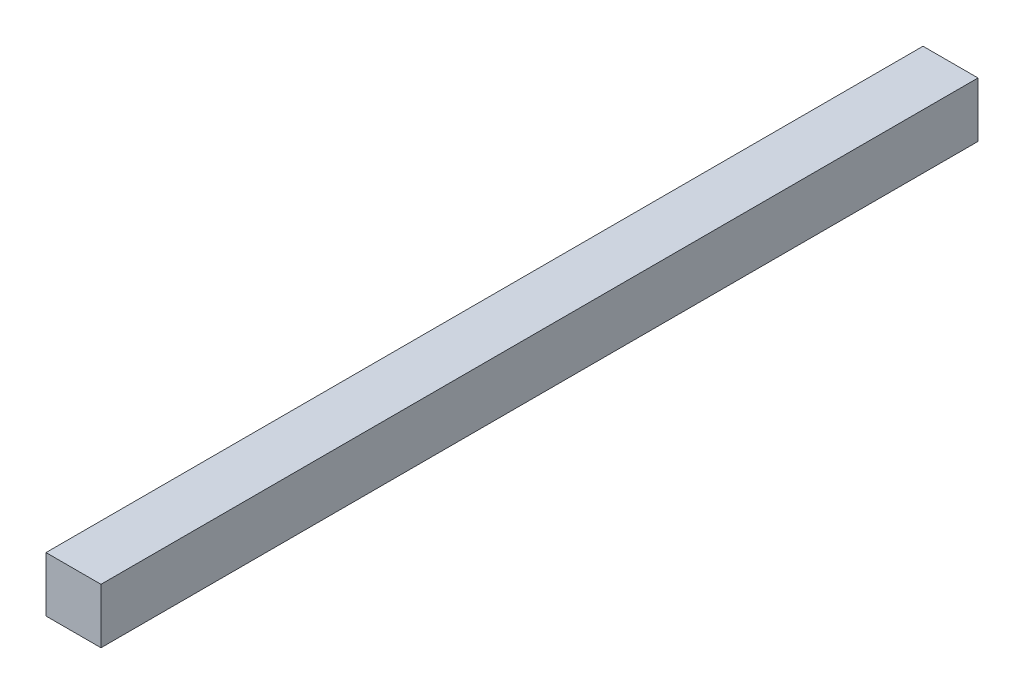
ISO-10303-21;
HEADER;
FILE_DESCRIPTION(('STEP AP214'),'2;1');
FILE_NAME('part.step','',(''),(''),'','','');
FILE_SCHEMA(('AUTOMOTIVE_DESIGN { 1 0 10303 214 1 1 1 1 }'));
ENDSEC;
DATA;
#1=APPLICATION_CONTEXT('core data for automotive mechanical design processes');
#2=APPLICATION_PROTOCOL_DEFINITION('international standard','automotive_design',2000,#1);
#3=PRODUCT_CONTEXT('',#1,'mechanical');
#4=PRODUCT('Part','Part','',(#3));
#5=PRODUCT_RELATED_PRODUCT_CATEGORY('part','',(#4));
#6=PRODUCT_DEFINITION_FORMATION('','',#4);
#7=PRODUCT_DEFINITION_CONTEXT('part definition',#1,'design');
#8=PRODUCT_DEFINITION('design','',#6,#7);
#9=PRODUCT_DEFINITION_SHAPE('','',#8);
#10=(LENGTH_UNIT() NAMED_UNIT(*) SI_UNIT(.MILLI.,.METRE.));
#11=(NAMED_UNIT(*) PLANE_ANGLE_UNIT() SI_UNIT($,.RADIAN.));
#12=(NAMED_UNIT(*) SI_UNIT($,.STERADIAN.) SOLID_ANGLE_UNIT());
#13=UNCERTAINTY_MEASURE_WITH_UNIT(LENGTH_MEASURE(1.E-05),#10,'distance_accuracy_value','');
#14=(GEOMETRIC_REPRESENTATION_CONTEXT(3) GLOBAL_UNCERTAINTY_ASSIGNED_CONTEXT((#13)) GLOBAL_UNIT_ASSIGNED_CONTEXT((#10,
#11,#12)) REPRESENTATION_CONTEXT('',''));
#15=CARTESIAN_POINT('',(0.,0.,0.));
#16=DIRECTION('',(0.,0.,1.));
#17=DIRECTION('',(1.,0.,0.));
#18=AXIS2_PLACEMENT_3D('',#15,#16,#17);
#19=CARTESIAN_POINT('',(0.,0.,319.));
#20=DIRECTION('',(1.,0.,0.));
#21=DIRECTION('',(0.,0.,-1.));
#22=AXIS2_PLACEMENT_3D('',#19,#20,#21);
#23=PLANE('',#22);
#24=DIRECTION('',(0.,-1.,0.));
#25=VECTOR('',#24,1.);
#26=CARTESIAN_POINT('',(0.,0.,0.));
#27=LINE('',#26,#25);
#28=CARTESIAN_POINT('',(0.,20.,0.));
#29=VERTEX_POINT('',#28);
#30=CARTESIAN_POINT('',(0.,0.,0.));
#31=VERTEX_POINT('',#30);
#32=EDGE_CURVE('E102',#29,#31,#27,.T.);
#33=ORIENTED_EDGE('',*,*,#32,.T.);
#34=DIRECTION('',(0.,0.,-1.));
#35=VECTOR('',#34,1.);
#36=CARTESIAN_POINT('',(0.,0.,319.));
#37=LINE('',#36,#35);
#38=CARTESIAN_POINT('',(0.,0.,319.));
#39=VERTEX_POINT('',#38);
#40=EDGE_CURVE('E11',#39,#31,#37,.T.);
#41=ORIENTED_EDGE('',*,*,#40,.F.);
#42=DIRECTION('',(0.,-1.,0.));
#43=VECTOR('',#42,1.);
#44=CARTESIAN_POINT('',(0.,0.,319.));
#45=LINE('',#44,#43);
#46=CARTESIAN_POINT('',(0.,20.,319.));
#47=VERTEX_POINT('',#46);
#48=EDGE_CURVE('E90',#47,#39,#45,.T.);
#49=ORIENTED_EDGE('',*,*,#48,.F.);
#50=DIRECTION('',(0.,0.,-1.));
#51=VECTOR('',#50,1.);
#52=CARTESIAN_POINT('',(0.,20.,319.));
#53=LINE('',#52,#51);
#54=EDGE_CURVE('E98',#47,#29,#53,.T.);
#55=ORIENTED_EDGE('',*,*,#54,.T.);
#56=EDGE_LOOP('',(#33,#41,#49,#55));
#57=FACE_BOUND('',#56,.T.);
#58=ADVANCED_FACE('F39',(#57),#23,.F.);
#59=CARTESIAN_POINT('',(0.,0.,319.));
#60=DIRECTION('',(0.,1.,0.));
#61=DIRECTION('',(0.,0.,1.));
#62=AXIS2_PLACEMENT_3D('',#59,#60,#61);
#63=PLANE('',#62);
#64=DIRECTION('',(1.,0.,0.));
#65=VECTOR('',#64,1.);
#66=CARTESIAN_POINT('',(0.,0.,0.));
#67=LINE('',#66,#65);
#68=CARTESIAN_POINT('',(20.,0.,0.));
#69=VERTEX_POINT('',#68);
#70=EDGE_CURVE('E94',#31,#69,#67,.T.);
#71=ORIENTED_EDGE('',*,*,#70,.T.);
#72=DIRECTION('',(0.,0.,-1.));
#73=VECTOR('',#72,1.);
#74=CARTESIAN_POINT('',(20.,0.,319.));
#75=LINE('',#74,#73);
#76=CARTESIAN_POINT('',(20.,0.,319.));
#77=VERTEX_POINT('',#76);
#78=EDGE_CURVE('E47',#77,#69,#75,.T.);
#79=ORIENTED_EDGE('',*,*,#78,.F.);
#80=DIRECTION('',(1.,0.,0.));
#81=VECTOR('',#80,1.);
#82=CARTESIAN_POINT('',(0.,0.,319.));
#83=LINE('',#82,#81);
#84=EDGE_CURVE('E85',#39,#77,#83,.T.);
#85=ORIENTED_EDGE('',*,*,#84,.F.);
#86=ORIENTED_EDGE('',*,*,#40,.T.);
#87=EDGE_LOOP('',(#71,#79,#85,#86));
#88=FACE_BOUND('',#87,.T.);
#89=ADVANCED_FACE('F93',(#88),#63,.F.);
#90=CARTESIAN_POINT('',(20.,0.,319.));
#91=DIRECTION('',(-1.,0.,0.));
#92=DIRECTION('',(0.,0.,1.));
#93=AXIS2_PLACEMENT_3D('',#90,#91,#92);
#94=PLANE('',#93);
#95=DIRECTION('',(0.,1.,0.));
#96=VECTOR('',#95,1.);
#97=CARTESIAN_POINT('',(20.,0.,0.));
#98=LINE('',#97,#96);
#99=CARTESIAN_POINT('',(20.,20.,0.));
#100=VERTEX_POINT('',#99);
#101=EDGE_CURVE('E72',#69,#100,#98,.T.);
#102=ORIENTED_EDGE('',*,*,#101,.T.);
#103=DIRECTION('',(0.,0.,-1.));
#104=VECTOR('',#103,1.);
#105=CARTESIAN_POINT('',(20.,20.,319.));
#106=LINE('',#105,#104);
#107=CARTESIAN_POINT('',(20.,20.,319.));
#108=VERTEX_POINT('',#107);
#109=EDGE_CURVE('E95',#108,#100,#106,.T.);
#110=ORIENTED_EDGE('',*,*,#109,.F.);
#111=DIRECTION('',(0.,1.,0.));
#112=VECTOR('',#111,1.);
#113=CARTESIAN_POINT('',(20.,0.,319.));
#114=LINE('',#113,#112);
#115=EDGE_CURVE('E88',#77,#108,#114,.T.);
#116=ORIENTED_EDGE('',*,*,#115,.F.);
#117=ORIENTED_EDGE('',*,*,#78,.T.);
#118=EDGE_LOOP('',(#102,#110,#116,#117));
#119=FACE_BOUND('',#118,.T.);
#120=ADVANCED_FACE('F96',(#119),#94,.F.);
#121=CARTESIAN_POINT('',(0.,20.,319.));
#122=DIRECTION('',(0.,-1.,0.));
#123=DIRECTION('',(0.,0.,-1.));
#124=AXIS2_PLACEMENT_3D('',#121,#122,#123);
#125=PLANE('',#124);
#126=DIRECTION('',(-1.,0.,0.));
#127=VECTOR('',#126,1.);
#128=CARTESIAN_POINT('',(0.,20.,0.));
#129=LINE('',#128,#127);
#130=EDGE_CURVE('E78',#100,#29,#129,.T.);
#131=ORIENTED_EDGE('',*,*,#130,.T.);
#132=ORIENTED_EDGE('',*,*,#54,.F.);
#133=DIRECTION('',(-1.,0.,0.));
#134=VECTOR('',#133,1.);
#135=CARTESIAN_POINT('',(0.,20.,319.));
#136=LINE('',#135,#134);
#137=EDGE_CURVE('E55',#108,#47,#136,.T.);
#138=ORIENTED_EDGE('',*,*,#137,.F.);
#139=ORIENTED_EDGE('',*,*,#109,.T.);
#140=EDGE_LOOP('',(#131,#132,#138,#139));
#141=FACE_BOUND('',#140,.T.);
#142=ADVANCED_FACE('F109',(#141),#125,.F.);
#143=CARTESIAN_POINT('',(0.,0.,319.));
#144=DIRECTION('',(0.,0.,-1.));
#145=DIRECTION('',(-1.,0.,0.));
#146=AXIS2_PLACEMENT_3D('',#143,#144,#145);
#147=PLANE('',#146);
#148=ORIENTED_EDGE('',*,*,#48,.T.);
#149=ORIENTED_EDGE('',*,*,#84,.T.);
#150=ORIENTED_EDGE('',*,*,#115,.T.);
#151=ORIENTED_EDGE('',*,*,#137,.T.);
#152=EDGE_LOOP('',(#148,#149,#150,#151));
#153=FACE_BOUND('',#152,.T.);
#154=ADVANCED_FACE('F86',(#153),#147,.F.);
#155=CARTESIAN_POINT('',(0.,0.,0.));
#156=DIRECTION('',(0.,0.,-1.));
#157=DIRECTION('',(-1.,0.,0.));
#158=AXIS2_PLACEMENT_3D('',#155,#156,#157);
#159=PLANE('',#158);
#160=ORIENTED_EDGE('',*,*,#32,.F.);
#161=ORIENTED_EDGE('',*,*,#130,.F.);
#162=ORIENTED_EDGE('',*,*,#101,.F.);
#163=ORIENTED_EDGE('',*,*,#70,.F.);
#164=EDGE_LOOP('',(#160,#161,#162,#163));
#165=FACE_BOUND('',#164,.T.);
#166=ADVANCED_FACE('F112',(#165),#159,.T.);
#167=CLOSED_SHELL('',(#58,#89,#120,#142,#154,#166));
#168=MANIFOLD_SOLID_BREP('B2',#167);
#169=ADVANCED_BREP_SHAPE_REPRESENTATION('',(#18,#168),#14);
#170=SHAPE_DEFINITION_REPRESENTATION(#9,#169);
ENDSEC;
END-ISO-10303-21;
